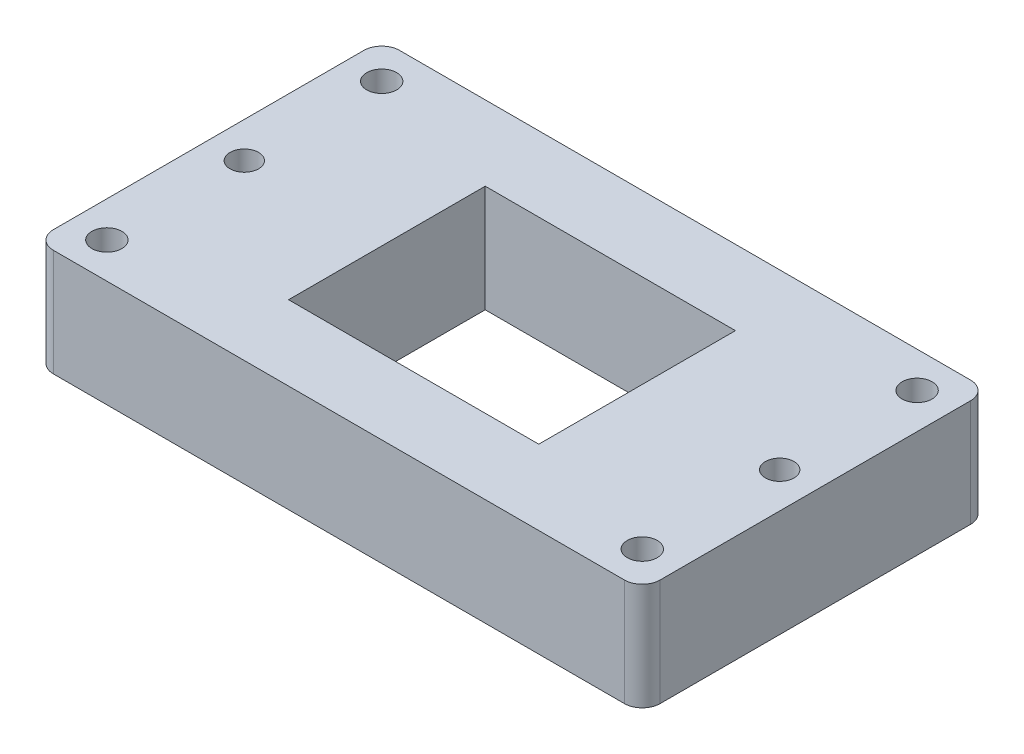
ISO-10303-21;
HEADER;
FILE_DESCRIPTION(('STEP AP214'),'2;1');
FILE_NAME('part.step','',(''),(''),'','','');
FILE_SCHEMA(('AUTOMOTIVE_DESIGN { 1 0 10303 214 1 1 1 1 }'));
ENDSEC;
DATA;
#1=APPLICATION_CONTEXT('core data for automotive mechanical design processes');
#2=APPLICATION_PROTOCOL_DEFINITION('international standard','automotive_design',2000,#1);
#3=PRODUCT_CONTEXT('',#1,'mechanical');
#4=PRODUCT('Part','Part','',(#3));
#5=PRODUCT_RELATED_PRODUCT_CATEGORY('part','',(#4));
#6=PRODUCT_DEFINITION_FORMATION('','',#4);
#7=PRODUCT_DEFINITION_CONTEXT('part definition',#1,'design');
#8=PRODUCT_DEFINITION('design','',#6,#7);
#9=PRODUCT_DEFINITION_SHAPE('','',#8);
#10=(LENGTH_UNIT() NAMED_UNIT(*) SI_UNIT(.MILLI.,.METRE.));
#11=(NAMED_UNIT(*) PLANE_ANGLE_UNIT() SI_UNIT($,.RADIAN.));
#12=(NAMED_UNIT(*) SI_UNIT($,.STERADIAN.) SOLID_ANGLE_UNIT());
#13=UNCERTAINTY_MEASURE_WITH_UNIT(LENGTH_MEASURE(1.E-05),#10,'distance_accuracy_value','');
#14=(GEOMETRIC_REPRESENTATION_CONTEXT(3) GLOBAL_UNCERTAINTY_ASSIGNED_CONTEXT((#13)) GLOBAL_UNIT_ASSIGNED_CONTEXT((#10,
#11,#12)) REPRESENTATION_CONTEXT('',''));
#15=CARTESIAN_POINT('',(0.,0.,0.));
#16=DIRECTION('',(0.,0.,1.));
#17=DIRECTION('',(1.,0.,0.));
#18=AXIS2_PLACEMENT_3D('',#15,#16,#17);
#19=CARTESIAN_POINT('',(0.,0.,0.));
#20=DIRECTION('',(0.,-1.,0.));
#21=DIRECTION('',(0.,0.,-1.));
#22=AXIS2_PLACEMENT_3D('',#19,#20,#21);
#23=PLANE('',#22);
#24=CARTESIAN_POINT('',(-75.,0.,-38.5));
#25=DIRECTION('',(0.,1.,0.));
#26=DIRECTION('',(0.,0.,1.));
#27=AXIS2_PLACEMENT_3D('',#24,#25,#26);
#28=CIRCLE('',#27,4.2);
#29=CARTESIAN_POINT('',(-75.,0.,-34.3));
#30=VERTEX_POINT('',#29);
#31=EDGE_CURVE('E461',#30,#30,#28,.T.);
#32=ORIENTED_EDGE('',*,*,#31,.F.);
#33=EDGE_LOOP('',(#32));
#34=FACE_BOUND('',#33,.T.);
#35=CARTESIAN_POINT('',(-75.,0.,38.5));
#36=DIRECTION('',(0.,1.,0.));
#37=DIRECTION('',(0.,0.,1.));
#38=AXIS2_PLACEMENT_3D('',#35,#36,#37);
#39=CIRCLE('',#38,4.2);
#40=CARTESIAN_POINT('',(-75.,0.,42.7));
#41=VERTEX_POINT('',#40);
#42=EDGE_CURVE('E466',#41,#41,#39,.T.);
#43=ORIENTED_EDGE('',*,*,#42,.F.);
#44=EDGE_LOOP('',(#43));
#45=FACE_BOUND('',#44,.T.);
#46=CARTESIAN_POINT('',(75.,0.,38.5));
#47=DIRECTION('',(0.,1.,0.));
#48=DIRECTION('',(0.,0.,1.));
#49=AXIS2_PLACEMENT_3D('',#46,#47,#48);
#50=CIRCLE('',#49,4.2);
#51=CARTESIAN_POINT('',(75.,0.,42.7));
#52=VERTEX_POINT('',#51);
#53=EDGE_CURVE('E476',#52,#52,#50,.T.);
#54=ORIENTED_EDGE('',*,*,#53,.F.);
#55=EDGE_LOOP('',(#54));
#56=FACE_BOUND('',#55,.T.);
#57=CARTESIAN_POINT('',(-75.,0.,0.));
#58=DIRECTION('',(0.,1.,0.));
#59=DIRECTION('',(0.,0.,1.));
#60=AXIS2_PLACEMENT_3D('',#57,#58,#59);
#61=CIRCLE('',#60,3.99999999999999);
#62=CARTESIAN_POINT('',(-75.,0.,3.99999999999999));
#63=VERTEX_POINT('',#62);
#64=EDGE_CURVE('E492',#63,#63,#61,.T.);
#65=ORIENTED_EDGE('',*,*,#64,.F.);
#66=EDGE_LOOP('',(#65));
#67=FACE_BOUND('',#66,.T.);
#68=CARTESIAN_POINT('',(75.,0.,0.));
#69=DIRECTION('',(0.,1.,0.));
#70=DIRECTION('',(0.,0.,1.));
#71=AXIS2_PLACEMENT_3D('',#68,#69,#70);
#72=CIRCLE('',#71,3.99999999999999);
#73=CARTESIAN_POINT('',(75.,0.,3.99999999999999));
#74=VERTEX_POINT('',#73);
#75=EDGE_CURVE('E500',#74,#74,#72,.T.);
#76=ORIENTED_EDGE('',*,*,#75,.F.);
#77=EDGE_LOOP('',(#76));
#78=FACE_BOUND('',#77,.T.);
#79=DIRECTION('',(-1.,0.,0.));
#80=VECTOR('',#79,1.);
#81=CARTESIAN_POINT('',(-85.,0.,-48.5));
#82=LINE('',#81,#80);
#83=CARTESIAN_POINT('',(80.,0.,-48.5));
#84=VERTEX_POINT('',#83);
#85=CARTESIAN_POINT('',(-80.,0.,-48.5));
#86=VERTEX_POINT('',#85);
#87=EDGE_CURVE('E208',#84,#86,#82,.T.);
#88=ORIENTED_EDGE('',*,*,#87,.T.);
#89=CARTESIAN_POINT('',(-80.,0.,-43.5));
#90=DIRECTION('',(0.,-1.,0.));
#91=DIRECTION('',(0.,0.,-1.));
#92=AXIS2_PLACEMENT_3D('',#89,#90,#91);
#93=CIRCLE('',#92,5.);
#94=CARTESIAN_POINT('',(-85.,0.,-43.5));
#95=VERTEX_POINT('',#94);
#96=EDGE_CURVE('E234',#86,#95,#93,.F.);
#97=ORIENTED_EDGE('',*,*,#96,.T.);
#98=DIRECTION('',(0.,0.,1.));
#99=VECTOR('',#98,1.);
#100=CARTESIAN_POINT('',(-85.,0.,48.5));
#101=LINE('',#100,#99);
#102=CARTESIAN_POINT('',(-85.,0.,43.5));
#103=VERTEX_POINT('',#102);
#104=EDGE_CURVE('E212',#95,#103,#101,.T.);
#105=ORIENTED_EDGE('',*,*,#104,.T.);
#106=CARTESIAN_POINT('',(-80.,0.,43.5));
#107=DIRECTION('',(0.,-1.,0.));
#108=DIRECTION('',(0.,0.,-1.));
#109=AXIS2_PLACEMENT_3D('',#106,#107,#108);
#110=CIRCLE('',#109,5.);
#111=CARTESIAN_POINT('',(-80.,0.,48.5));
#112=VERTEX_POINT('',#111);
#113=EDGE_CURVE('E231',#103,#112,#110,.F.);
#114=ORIENTED_EDGE('',*,*,#113,.T.);
#115=DIRECTION('',(1.,0.,0.));
#116=VECTOR('',#115,1.);
#117=CARTESIAN_POINT('',(-85.,0.,48.5));
#118=LINE('',#117,#116);
#119=CARTESIAN_POINT('',(80.,0.,48.5));
#120=VERTEX_POINT('',#119);
#121=EDGE_CURVE('E192',#112,#120,#118,.T.);
#122=ORIENTED_EDGE('',*,*,#121,.T.);
#123=CARTESIAN_POINT('',(80.,0.,43.5));
#124=DIRECTION('',(0.,-1.,0.));
#125=DIRECTION('',(0.,0.,-1.));
#126=AXIS2_PLACEMENT_3D('',#123,#124,#125);
#127=CIRCLE('',#126,5.);
#128=CARTESIAN_POINT('',(85.,0.,43.5));
#129=VERTEX_POINT('',#128);
#130=EDGE_CURVE('E225',#120,#129,#127,.F.);
#131=ORIENTED_EDGE('',*,*,#130,.T.);
#132=DIRECTION('',(0.,0.,-1.));
#133=VECTOR('',#132,1.);
#134=CARTESIAN_POINT('',(85.,0.,48.5));
#135=LINE('',#134,#133);
#136=CARTESIAN_POINT('',(85.,0.,-43.5));
#137=VERTEX_POINT('',#136);
#138=EDGE_CURVE('E153',#129,#137,#135,.T.);
#139=ORIENTED_EDGE('',*,*,#138,.T.);
#140=CARTESIAN_POINT('',(80.,0.,-43.5));
#141=DIRECTION('',(0.,-1.,0.));
#142=DIRECTION('',(0.,0.,-1.));
#143=AXIS2_PLACEMENT_3D('',#140,#141,#142);
#144=CIRCLE('',#143,5.);
#145=EDGE_CURVE('E228',#137,#84,#144,.F.);
#146=ORIENTED_EDGE('',*,*,#145,.T.);
#147=EDGE_LOOP('',(#88,#97,#105,#114,#122,#131,#139,#146));
#148=FACE_BOUND('',#147,.T.);
#149=DIRECTION('',(0.,0.,-1.));
#150=VECTOR('',#149,1.);
#151=CARTESIAN_POINT('',(35.05,0.,27.55));
#152=LINE('',#151,#150);
#153=CARTESIAN_POINT('',(35.05,0.,27.55));
#154=VERTEX_POINT('',#153);
#155=CARTESIAN_POINT('',(35.05,0.,-27.55));
#156=VERTEX_POINT('',#155);
#157=EDGE_CURVE('E135',#154,#156,#152,.T.);
#158=ORIENTED_EDGE('',*,*,#157,.F.);
#159=DIRECTION('',(1.,0.,0.));
#160=VECTOR('',#159,1.);
#161=CARTESIAN_POINT('',(-35.05,0.,27.55));
#162=LINE('',#161,#160);
#163=CARTESIAN_POINT('',(-35.05,0.,27.55));
#164=VERTEX_POINT('',#163);
#165=EDGE_CURVE('E163',#164,#154,#162,.T.);
#166=ORIENTED_EDGE('',*,*,#165,.F.);
#167=DIRECTION('',(0.,0.,1.));
#168=VECTOR('',#167,1.);
#169=CARTESIAN_POINT('',(-35.05,0.,-27.55));
#170=LINE('',#169,#168);
#171=CARTESIAN_POINT('',(-35.05,0.,-27.55));
#172=VERTEX_POINT('',#171);
#173=EDGE_CURVE('E158',#172,#164,#170,.T.);
#174=ORIENTED_EDGE('',*,*,#173,.F.);
#175=DIRECTION('',(-1.,0.,0.));
#176=VECTOR('',#175,1.);
#177=CARTESIAN_POINT('',(35.05,0.,-27.55));
#178=LINE('',#177,#176);
#179=EDGE_CURVE('E144',#156,#172,#178,.T.);
#180=ORIENTED_EDGE('',*,*,#179,.F.);
#181=EDGE_LOOP('',(#158,#166,#174,#180));
#182=FACE_BOUND('',#181,.T.);
#183=CARTESIAN_POINT('',(75.,0.,-38.5));
#184=DIRECTION('',(0.,1.,0.));
#185=DIRECTION('',(0.,0.,1.));
#186=AXIS2_PLACEMENT_3D('',#183,#184,#185);
#187=CIRCLE('',#186,4.2);
#188=CARTESIAN_POINT('',(75.,0.,-34.3));
#189=VERTEX_POINT('',#188);
#190=EDGE_CURVE('E484',#189,#189,#187,.T.);
#191=ORIENTED_EDGE('',*,*,#190,.F.);
#192=EDGE_LOOP('',(#191));
#193=FACE_BOUND('',#192,.T.);
#194=ADVANCED_FACE('F45',(#34,#45,#56,#67,#78,#148,#182,#193),#23,.F.);
#195=CARTESIAN_POINT('',(0.,-30.,0.));
#196=DIRECTION('',(0.,-1.,0.));
#197=DIRECTION('',(0.,0.,-1.));
#198=AXIS2_PLACEMENT_3D('',#195,#196,#197);
#199=PLANE('',#198);
#200=CARTESIAN_POINT('',(-75.,-30.,-38.5));
#201=DIRECTION('',(0.,1.,0.));
#202=DIRECTION('',(0.,0.,1.));
#203=AXIS2_PLACEMENT_3D('',#200,#201,#202);
#204=CIRCLE('',#203,4.2);
#205=CARTESIAN_POINT('',(-75.,-30.,-34.3));
#206=VERTEX_POINT('',#205);
#207=EDGE_CURVE('E459',#206,#206,#204,.T.);
#208=ORIENTED_EDGE('',*,*,#207,.T.);
#209=EDGE_LOOP('',(#208));
#210=FACE_BOUND('',#209,.T.);
#211=CARTESIAN_POINT('',(-75.,-30.,38.5));
#212=DIRECTION('',(0.,1.,0.));
#213=DIRECTION('',(0.,0.,1.));
#214=AXIS2_PLACEMENT_3D('',#211,#212,#213);
#215=CIRCLE('',#214,4.2);
#216=CARTESIAN_POINT('',(-75.,-30.,42.7));
#217=VERTEX_POINT('',#216);
#218=EDGE_CURVE('E472',#217,#217,#215,.T.);
#219=ORIENTED_EDGE('',*,*,#218,.T.);
#220=EDGE_LOOP('',(#219));
#221=FACE_BOUND('',#220,.T.);
#222=CARTESIAN_POINT('',(75.,-30.,38.5));
#223=DIRECTION('',(0.,1.,0.));
#224=DIRECTION('',(0.,0.,1.));
#225=AXIS2_PLACEMENT_3D('',#222,#223,#224);
#226=CIRCLE('',#225,4.2);
#227=CARTESIAN_POINT('',(75.,-30.,42.7));
#228=VERTEX_POINT('',#227);
#229=EDGE_CURVE('E480',#228,#228,#226,.T.);
#230=ORIENTED_EDGE('',*,*,#229,.T.);
#231=EDGE_LOOP('',(#230));
#232=FACE_BOUND('',#231,.T.);
#233=CARTESIAN_POINT('',(75.,-30.,-38.5));
#234=DIRECTION('',(0.,1.,0.));
#235=DIRECTION('',(0.,0.,1.));
#236=AXIS2_PLACEMENT_3D('',#233,#234,#235);
#237=CIRCLE('',#236,4.2);
#238=CARTESIAN_POINT('',(75.,-30.,-34.3));
#239=VERTEX_POINT('',#238);
#240=EDGE_CURVE('E488',#239,#239,#237,.T.);
#241=ORIENTED_EDGE('',*,*,#240,.T.);
#242=EDGE_LOOP('',(#241));
#243=FACE_BOUND('',#242,.T.);
#244=CARTESIAN_POINT('',(-75.,-30.,0.));
#245=DIRECTION('',(0.,1.,0.));
#246=DIRECTION('',(0.,0.,1.));
#247=AXIS2_PLACEMENT_3D('',#244,#245,#246);
#248=CIRCLE('',#247,3.99999999999999);
#249=CARTESIAN_POINT('',(-75.,-30.,3.99999999999999));
#250=VERTEX_POINT('',#249);
#251=EDGE_CURVE('E496',#250,#250,#248,.T.);
#252=ORIENTED_EDGE('',*,*,#251,.T.);
#253=EDGE_LOOP('',(#252));
#254=FACE_BOUND('',#253,.T.);
#255=CARTESIAN_POINT('',(75.,-30.,0.));
#256=DIRECTION('',(0.,1.,0.));
#257=DIRECTION('',(0.,0.,1.));
#258=AXIS2_PLACEMENT_3D('',#255,#256,#257);
#259=CIRCLE('',#258,3.99999999999999);
#260=CARTESIAN_POINT('',(75.,-30.,3.99999999999999));
#261=VERTEX_POINT('',#260);
#262=EDGE_CURVE('E171',#261,#261,#259,.T.);
#263=ORIENTED_EDGE('',*,*,#262,.T.);
#264=EDGE_LOOP('',(#263));
#265=FACE_BOUND('',#264,.T.);
#266=DIRECTION('',(0.,0.,1.));
#267=VECTOR('',#266,1.);
#268=CARTESIAN_POINT('',(-85.,-30.,48.5));
#269=LINE('',#268,#267);
#270=CARTESIAN_POINT('',(-85.,-30.,-43.5));
#271=VERTEX_POINT('',#270);
#272=CARTESIAN_POINT('',(-85.,-30.,43.5));
#273=VERTEX_POINT('',#272);
#274=EDGE_CURVE('E196',#271,#273,#269,.T.);
#275=ORIENTED_EDGE('',*,*,#274,.F.);
#276=CARTESIAN_POINT('',(-80.,-30.,-43.5));
#277=DIRECTION('',(0.,-1.,0.));
#278=DIRECTION('',(0.,0.,-1.));
#279=AXIS2_PLACEMENT_3D('',#276,#277,#278);
#280=CIRCLE('',#279,5.);
#281=CARTESIAN_POINT('',(-80.,-30.,-48.5));
#282=VERTEX_POINT('',#281);
#283=EDGE_CURVE('E253',#271,#282,#280,.T.);
#284=ORIENTED_EDGE('',*,*,#283,.T.);
#285=DIRECTION('',(-1.,0.,0.));
#286=VECTOR('',#285,1.);
#287=CARTESIAN_POINT('',(-85.,-30.,-48.5));
#288=LINE('',#287,#286);
#289=CARTESIAN_POINT('',(80.,-30.,-48.5));
#290=VERTEX_POINT('',#289);
#291=EDGE_CURVE('E191',#290,#282,#288,.T.);
#292=ORIENTED_EDGE('',*,*,#291,.F.);
#293=CARTESIAN_POINT('',(80.,-30.,-43.5));
#294=DIRECTION('',(0.,-1.,0.));
#295=DIRECTION('',(0.,0.,-1.));
#296=AXIS2_PLACEMENT_3D('',#293,#294,#295);
#297=CIRCLE('',#296,5.);
#298=CARTESIAN_POINT('',(85.,-30.,-43.5));
#299=VERTEX_POINT('',#298);
#300=EDGE_CURVE('E247',#290,#299,#297,.T.);
#301=ORIENTED_EDGE('',*,*,#300,.T.);
#302=DIRECTION('',(0.,0.,-1.));
#303=VECTOR('',#302,1.);
#304=CARTESIAN_POINT('',(85.,-30.,48.5));
#305=LINE('',#304,#303);
#306=CARTESIAN_POINT('',(85.,-30.,43.5));
#307=VERTEX_POINT('',#306);
#308=EDGE_CURVE('E187',#307,#299,#305,.T.);
#309=ORIENTED_EDGE('',*,*,#308,.F.);
#310=CARTESIAN_POINT('',(80.,-30.,43.5));
#311=DIRECTION('',(0.,-1.,0.));
#312=DIRECTION('',(0.,0.,-1.));
#313=AXIS2_PLACEMENT_3D('',#310,#311,#312);
#314=CIRCLE('',#313,5.);
#315=CARTESIAN_POINT('',(80.,-30.,48.5));
#316=VERTEX_POINT('',#315);
#317=EDGE_CURVE('E244',#307,#316,#314,.T.);
#318=ORIENTED_EDGE('',*,*,#317,.T.);
#319=DIRECTION('',(1.,0.,0.));
#320=VECTOR('',#319,1.);
#321=CARTESIAN_POINT('',(-85.,-30.,48.5));
#322=LINE('',#321,#320);
#323=CARTESIAN_POINT('',(-80.,-30.,48.5));
#324=VERTEX_POINT('',#323);
#325=EDGE_CURVE('E200',#324,#316,#322,.T.);
#326=ORIENTED_EDGE('',*,*,#325,.F.);
#327=CARTESIAN_POINT('',(-80.,-30.,43.5));
#328=DIRECTION('',(0.,-1.,0.));
#329=DIRECTION('',(0.,0.,-1.));
#330=AXIS2_PLACEMENT_3D('',#327,#328,#329);
#331=CIRCLE('',#330,5.);
#332=EDGE_CURVE('E250',#324,#273,#331,.T.);
#333=ORIENTED_EDGE('',*,*,#332,.T.);
#334=EDGE_LOOP('',(#275,#284,#292,#301,#309,#318,#326,#333));
#335=FACE_BOUND('',#334,.T.);
#336=DIRECTION('',(1.,0.,0.));
#337=VECTOR('',#336,1.);
#338=CARTESIAN_POINT('',(-35.05,-30.,27.55));
#339=LINE('',#338,#337);
#340=CARTESIAN_POINT('',(-35.05,-30.,27.55));
#341=VERTEX_POINT('',#340);
#342=CARTESIAN_POINT('',(35.05,-30.,27.55));
#343=VERTEX_POINT('',#342);
#344=EDGE_CURVE('E145',#341,#343,#339,.T.);
#345=ORIENTED_EDGE('',*,*,#344,.T.);
#346=DIRECTION('',(0.,0.,-1.));
#347=VECTOR('',#346,1.);
#348=CARTESIAN_POINT('',(35.05,-30.,27.55));
#349=LINE('',#348,#347);
#350=CARTESIAN_POINT('',(35.05,-30.,-27.55));
#351=VERTEX_POINT('',#350);
#352=EDGE_CURVE('E61',#343,#351,#349,.T.);
#353=ORIENTED_EDGE('',*,*,#352,.T.);
#354=DIRECTION('',(-1.,0.,0.));
#355=VECTOR('',#354,1.);
#356=CARTESIAN_POINT('',(35.05,-30.,-27.55));
#357=LINE('',#356,#355);
#358=CARTESIAN_POINT('',(-35.05,-30.,-27.55));
#359=VERTEX_POINT('',#358);
#360=EDGE_CURVE('E151',#351,#359,#357,.T.);
#361=ORIENTED_EDGE('',*,*,#360,.T.);
#362=DIRECTION('',(0.,0.,1.));
#363=VECTOR('',#362,1.);
#364=CARTESIAN_POINT('',(-35.05,-30.,-27.55));
#365=LINE('',#364,#363);
#366=EDGE_CURVE('E174',#359,#341,#365,.T.);
#367=ORIENTED_EDGE('',*,*,#366,.T.);
#368=EDGE_LOOP('',(#345,#353,#361,#367));
#369=FACE_BOUND('',#368,.T.);
#370=ADVANCED_FACE('F274',(#210,#221,#232,#243,#254,#265,#335,#369),#199,.T.);
#371=CARTESIAN_POINT('',(85.,-30.,48.5));
#372=DIRECTION('',(1.,0.,0.));
#373=DIRECTION('',(0.,0.,-1.));
#374=AXIS2_PLACEMENT_3D('',#371,#372,#373);
#375=PLANE('',#374);
#376=ORIENTED_EDGE('',*,*,#308,.T.);
#377=DIRECTION('',(0.,1.,0.));
#378=VECTOR('',#377,1.);
#379=CARTESIAN_POINT('',(85.,-30.,-43.5));
#380=LINE('',#379,#378);
#381=EDGE_CURVE('E11',#299,#137,#380,.T.);
#382=ORIENTED_EDGE('',*,*,#381,.T.);
#383=ORIENTED_EDGE('',*,*,#138,.F.);
#384=DIRECTION('',(0.,1.,0.));
#385=VECTOR('',#384,1.);
#386=CARTESIAN_POINT('',(85.,-30.,43.5));
#387=LINE('',#386,#385);
#388=EDGE_CURVE('E54',#129,#307,#387,.F.);
#389=ORIENTED_EDGE('',*,*,#388,.T.);
#390=EDGE_LOOP('',(#376,#382,#383,#389));
#391=FACE_BOUND('',#390,.T.);
#392=ADVANCED_FACE('F268',(#391),#375,.T.);
#393=CARTESIAN_POINT('',(-85.,-30.,48.5));
#394=DIRECTION('',(0.,0.,1.));
#395=DIRECTION('',(1.,0.,0.));
#396=AXIS2_PLACEMENT_3D('',#393,#394,#395);
#397=PLANE('',#396);
#398=ORIENTED_EDGE('',*,*,#121,.F.);
#399=DIRECTION('',(0.,1.,0.));
#400=VECTOR('',#399,1.);
#401=CARTESIAN_POINT('',(-80.,-30.,48.5));
#402=LINE('',#401,#400);
#403=EDGE_CURVE('E260',#112,#324,#402,.F.);
#404=ORIENTED_EDGE('',*,*,#403,.T.);
#405=ORIENTED_EDGE('',*,*,#325,.T.);
#406=DIRECTION('',(0.,1.,0.));
#407=VECTOR('',#406,1.);
#408=CARTESIAN_POINT('',(80.,-30.,48.5));
#409=LINE('',#408,#407);
#410=EDGE_CURVE('E256',#316,#120,#409,.T.);
#411=ORIENTED_EDGE('',*,*,#410,.T.);
#412=EDGE_LOOP('',(#398,#404,#405,#411));
#413=FACE_BOUND('',#412,.T.);
#414=ADVANCED_FACE('F282',(#413),#397,.T.);
#415=CARTESIAN_POINT('',(-85.,-30.,48.5));
#416=DIRECTION('',(-1.,0.,0.));
#417=DIRECTION('',(0.,0.,1.));
#418=AXIS2_PLACEMENT_3D('',#415,#416,#417);
#419=PLANE('',#418);
#420=ORIENTED_EDGE('',*,*,#104,.F.);
#421=DIRECTION('',(0.,1.,0.));
#422=VECTOR('',#421,1.);
#423=CARTESIAN_POINT('',(-85.,-30.,-43.5));
#424=LINE('',#423,#422);
#425=EDGE_CURVE('E241',#95,#271,#424,.F.);
#426=ORIENTED_EDGE('',*,*,#425,.T.);
#427=ORIENTED_EDGE('',*,*,#274,.T.);
#428=DIRECTION('',(0.,1.,0.));
#429=VECTOR('',#428,1.);
#430=CARTESIAN_POINT('',(-85.,-30.,43.5));
#431=LINE('',#430,#429);
#432=EDGE_CURVE('E237',#273,#103,#431,.T.);
#433=ORIENTED_EDGE('',*,*,#432,.T.);
#434=EDGE_LOOP('',(#420,#426,#427,#433));
#435=FACE_BOUND('',#434,.T.);
#436=ADVANCED_FACE('F291',(#435),#419,.T.);
#437=CARTESIAN_POINT('',(-85.,-30.,-48.5));
#438=DIRECTION('',(0.,0.,-1.));
#439=DIRECTION('',(-1.,0.,0.));
#440=AXIS2_PLACEMENT_3D('',#437,#438,#439);
#441=PLANE('',#440);
#442=ORIENTED_EDGE('',*,*,#291,.T.);
#443=DIRECTION('',(0.,1.,0.));
#444=VECTOR('',#443,1.);
#445=CARTESIAN_POINT('',(-80.,-30.,-48.5));
#446=LINE('',#445,#444);
#447=EDGE_CURVE('E221',#282,#86,#446,.T.);
#448=ORIENTED_EDGE('',*,*,#447,.T.);
#449=ORIENTED_EDGE('',*,*,#87,.F.);
#450=DIRECTION('',(0.,1.,0.));
#451=VECTOR('',#450,1.);
#452=CARTESIAN_POINT('',(80.,-30.,-48.5));
#453=LINE('',#452,#451);
#454=EDGE_CURVE('E204',#84,#290,#453,.F.);
#455=ORIENTED_EDGE('',*,*,#454,.T.);
#456=EDGE_LOOP('',(#442,#448,#449,#455));
#457=FACE_BOUND('',#456,.T.);
#458=ADVANCED_FACE('F299',(#457),#441,.T.);
#459=CARTESIAN_POINT('',(-80.,-30.,-43.5));
#460=DIRECTION('',(0.,1.,0.));
#461=DIRECTION('',(0.,0.,1.));
#462=AXIS2_PLACEMENT_3D('',#459,#460,#461);
#463=CYLINDRICAL_SURFACE('',#462,5.);
#464=ORIENTED_EDGE('',*,*,#283,.F.);
#465=ORIENTED_EDGE('',*,*,#425,.F.);
#466=ORIENTED_EDGE('',*,*,#96,.F.);
#467=ORIENTED_EDGE('',*,*,#447,.F.);
#468=EDGE_LOOP('',(#464,#465,#466,#467));
#469=FACE_BOUND('',#468,.T.);
#470=ADVANCED_FACE('F296',(#469),#463,.T.);
#471=CARTESIAN_POINT('',(-80.,-30.,43.5));
#472=DIRECTION('',(0.,1.,0.));
#473=DIRECTION('',(0.,0.,1.));
#474=AXIS2_PLACEMENT_3D('',#471,#472,#473);
#475=CYLINDRICAL_SURFACE('',#474,5.);
#476=ORIENTED_EDGE('',*,*,#332,.F.);
#477=ORIENTED_EDGE('',*,*,#403,.F.);
#478=ORIENTED_EDGE('',*,*,#113,.F.);
#479=ORIENTED_EDGE('',*,*,#432,.F.);
#480=EDGE_LOOP('',(#476,#477,#478,#479));
#481=FACE_BOUND('',#480,.T.);
#482=ADVANCED_FACE('F289',(#481),#475,.T.);
#483=CARTESIAN_POINT('',(80.,-30.,-43.5));
#484=DIRECTION('',(0.,1.,0.));
#485=DIRECTION('',(0.,0.,1.));
#486=AXIS2_PLACEMENT_3D('',#483,#484,#485);
#487=CYLINDRICAL_SURFACE('',#486,5.);
#488=ORIENTED_EDGE('',*,*,#300,.F.);
#489=ORIENTED_EDGE('',*,*,#454,.F.);
#490=ORIENTED_EDGE('',*,*,#145,.F.);
#491=ORIENTED_EDGE('',*,*,#381,.F.);
#492=EDGE_LOOP('',(#488,#489,#490,#491));
#493=FACE_BOUND('',#492,.T.);
#494=ADVANCED_FACE('F302',(#493),#487,.T.);
#495=CARTESIAN_POINT('',(80.,-30.,43.5));
#496=DIRECTION('',(0.,1.,0.));
#497=DIRECTION('',(0.,0.,1.));
#498=AXIS2_PLACEMENT_3D('',#495,#496,#497);
#499=CYLINDRICAL_SURFACE('',#498,5.);
#500=ORIENTED_EDGE('',*,*,#317,.F.);
#501=ORIENTED_EDGE('',*,*,#388,.F.);
#502=ORIENTED_EDGE('',*,*,#130,.F.);
#503=ORIENTED_EDGE('',*,*,#410,.F.);
#504=EDGE_LOOP('',(#500,#501,#502,#503));
#505=FACE_BOUND('',#504,.T.);
#506=ADVANCED_FACE('F47',(#505),#499,.T.);
#507=CARTESIAN_POINT('',(35.05,0.,27.55));
#508=DIRECTION('',(-1.,0.,0.));
#509=DIRECTION('',(0.,0.,1.));
#510=AXIS2_PLACEMENT_3D('',#507,#508,#509);
#511=PLANE('',#510);
#512=ORIENTED_EDGE('',*,*,#352,.F.);
#513=DIRECTION('',(0.,-1.,0.));
#514=VECTOR('',#513,1.);
#515=CARTESIAN_POINT('',(35.05,0.,27.55));
#516=LINE('',#515,#514);
#517=EDGE_CURVE('E139',#154,#343,#516,.T.);
#518=ORIENTED_EDGE('',*,*,#517,.F.);
#519=ORIENTED_EDGE('',*,*,#157,.T.);
#520=DIRECTION('',(0.,-1.,0.));
#521=VECTOR('',#520,1.);
#522=CARTESIAN_POINT('',(35.05,0.,-27.55));
#523=LINE('',#522,#521);
#524=EDGE_CURVE('E138',#156,#351,#523,.T.);
#525=ORIENTED_EDGE('',*,*,#524,.T.);
#526=EDGE_LOOP('',(#512,#518,#519,#525));
#527=FACE_BOUND('',#526,.T.);
#528=ADVANCED_FACE('F137',(#527),#511,.T.);
#529=CARTESIAN_POINT('',(35.05,0.,-27.55));
#530=DIRECTION('',(0.,0.,1.));
#531=DIRECTION('',(1.,0.,0.));
#532=AXIS2_PLACEMENT_3D('',#529,#530,#531);
#533=PLANE('',#532);
#534=ORIENTED_EDGE('',*,*,#360,.F.);
#535=ORIENTED_EDGE('',*,*,#524,.F.);
#536=ORIENTED_EDGE('',*,*,#179,.T.);
#537=DIRECTION('',(0.,-1.,0.));
#538=VECTOR('',#537,1.);
#539=CARTESIAN_POINT('',(-35.05,0.,-27.55));
#540=LINE('',#539,#538);
#541=EDGE_CURVE('E154',#172,#359,#540,.T.);
#542=ORIENTED_EDGE('',*,*,#541,.T.);
#543=EDGE_LOOP('',(#534,#535,#536,#542));
#544=FACE_BOUND('',#543,.T.);
#545=ADVANCED_FACE('F148',(#544),#533,.T.);
#546=CARTESIAN_POINT('',(-35.05,0.,-27.55));
#547=DIRECTION('',(1.,0.,0.));
#548=DIRECTION('',(0.,0.,-1.));
#549=AXIS2_PLACEMENT_3D('',#546,#547,#548);
#550=PLANE('',#549);
#551=ORIENTED_EDGE('',*,*,#366,.F.);
#552=ORIENTED_EDGE('',*,*,#541,.F.);
#553=ORIENTED_EDGE('',*,*,#173,.T.);
#554=DIRECTION('',(0.,-1.,0.));
#555=VECTOR('',#554,1.);
#556=CARTESIAN_POINT('',(-35.05,0.,27.55));
#557=LINE('',#556,#555);
#558=EDGE_CURVE('E69',#164,#341,#557,.T.);
#559=ORIENTED_EDGE('',*,*,#558,.T.);
#560=EDGE_LOOP('',(#551,#552,#553,#559));
#561=FACE_BOUND('',#560,.T.);
#562=ADVANCED_FACE('F372',(#561),#550,.T.);
#563=CARTESIAN_POINT('',(-35.05,0.,27.55));
#564=DIRECTION('',(0.,0.,-1.));
#565=DIRECTION('',(-1.,0.,0.));
#566=AXIS2_PLACEMENT_3D('',#563,#564,#565);
#567=PLANE('',#566);
#568=ORIENTED_EDGE('',*,*,#344,.F.);
#569=ORIENTED_EDGE('',*,*,#558,.F.);
#570=ORIENTED_EDGE('',*,*,#165,.T.);
#571=ORIENTED_EDGE('',*,*,#517,.T.);
#572=EDGE_LOOP('',(#568,#569,#570,#571));
#573=FACE_BOUND('',#572,.T.);
#574=ADVANCED_FACE('F381',(#573),#567,.T.);
#575=CARTESIAN_POINT('',(75.,0.,0.));
#576=DIRECTION('',(0.,1.,0.));
#577=DIRECTION('',(0.,0.,1.));
#578=AXIS2_PLACEMENT_3D('',#575,#576,#577);
#579=CYLINDRICAL_SURFACE('',#578,3.99999999999999);
#580=ORIENTED_EDGE('',*,*,#262,.F.);
#581=EDGE_LOOP('',(#580));
#582=FACE_BOUND('',#581,.T.);
#583=ORIENTED_EDGE('',*,*,#75,.T.);
#584=EDGE_LOOP('',(#583));
#585=FACE_BOUND('',#584,.T.);
#586=ADVANCED_FACE('F391',(#582,#585),#579,.F.);
#587=CARTESIAN_POINT('',(-75.,0.,0.));
#588=DIRECTION('',(0.,1.,0.));
#589=DIRECTION('',(0.,0.,1.));
#590=AXIS2_PLACEMENT_3D('',#587,#588,#589);
#591=CYLINDRICAL_SURFACE('',#590,3.99999999999999);
#592=ORIENTED_EDGE('',*,*,#251,.F.);
#593=EDGE_LOOP('',(#592));
#594=FACE_BOUND('',#593,.T.);
#595=ORIENTED_EDGE('',*,*,#64,.T.);
#596=EDGE_LOOP('',(#595));
#597=FACE_BOUND('',#596,.T.);
#598=ADVANCED_FACE('F400',(#594,#597),#591,.F.);
#599=CARTESIAN_POINT('',(75.,0.,-38.5));
#600=DIRECTION('',(0.,1.,0.));
#601=DIRECTION('',(0.,0.,1.));
#602=AXIS2_PLACEMENT_3D('',#599,#600,#601);
#603=CYLINDRICAL_SURFACE('',#602,4.2);
#604=ORIENTED_EDGE('',*,*,#240,.F.);
#605=EDGE_LOOP('',(#604));
#606=FACE_BOUND('',#605,.T.);
#607=ORIENTED_EDGE('',*,*,#190,.T.);
#608=EDGE_LOOP('',(#607));
#609=FACE_BOUND('',#608,.T.);
#610=ADVANCED_FACE('F408',(#606,#609),#603,.F.);
#611=CARTESIAN_POINT('',(75.,0.,38.5));
#612=DIRECTION('',(0.,1.,0.));
#613=DIRECTION('',(0.,0.,1.));
#614=AXIS2_PLACEMENT_3D('',#611,#612,#613);
#615=CYLINDRICAL_SURFACE('',#614,4.2);
#616=ORIENTED_EDGE('',*,*,#229,.F.);
#617=EDGE_LOOP('',(#616));
#618=FACE_BOUND('',#617,.T.);
#619=ORIENTED_EDGE('',*,*,#53,.T.);
#620=EDGE_LOOP('',(#619));
#621=FACE_BOUND('',#620,.T.);
#622=ADVANCED_FACE('F423',(#618,#621),#615,.F.);
#623=CARTESIAN_POINT('',(-75.,0.,38.5));
#624=DIRECTION('',(0.,1.,0.));
#625=DIRECTION('',(0.,0.,1.));
#626=AXIS2_PLACEMENT_3D('',#623,#624,#625);
#627=CYLINDRICAL_SURFACE('',#626,4.2);
#628=ORIENTED_EDGE('',*,*,#218,.F.);
#629=EDGE_LOOP('',(#628));
#630=FACE_BOUND('',#629,.T.);
#631=ORIENTED_EDGE('',*,*,#42,.T.);
#632=EDGE_LOOP('',(#631));
#633=FACE_BOUND('',#632,.T.);
#634=ADVANCED_FACE('F433',(#630,#633),#627,.F.);
#635=CARTESIAN_POINT('',(-75.,0.,-38.5));
#636=DIRECTION('',(0.,1.,0.));
#637=DIRECTION('',(0.,0.,1.));
#638=AXIS2_PLACEMENT_3D('',#635,#636,#637);
#639=CYLINDRICAL_SURFACE('',#638,4.2);
#640=ORIENTED_EDGE('',*,*,#207,.F.);
#641=EDGE_LOOP('',(#640));
#642=FACE_BOUND('',#641,.T.);
#643=ORIENTED_EDGE('',*,*,#31,.T.);
#644=EDGE_LOOP('',(#643));
#645=FACE_BOUND('',#644,.T.);
#646=ADVANCED_FACE('F443',(#642,#645),#639,.F.);
#647=CLOSED_SHELL('',(#194,#370,#392,#414,#436,#458,#470,#482,#494,#506,#528,#545,#562,#574,
#586,#598,#610,#622,#634,#646));
#648=MANIFOLD_SOLID_BREP('B2',#647);
#649=ADVANCED_BREP_SHAPE_REPRESENTATION('',(#18,#648),#14);
#650=SHAPE_DEFINITION_REPRESENTATION(#9,#649);
ENDSEC;
END-ISO-10303-21;
